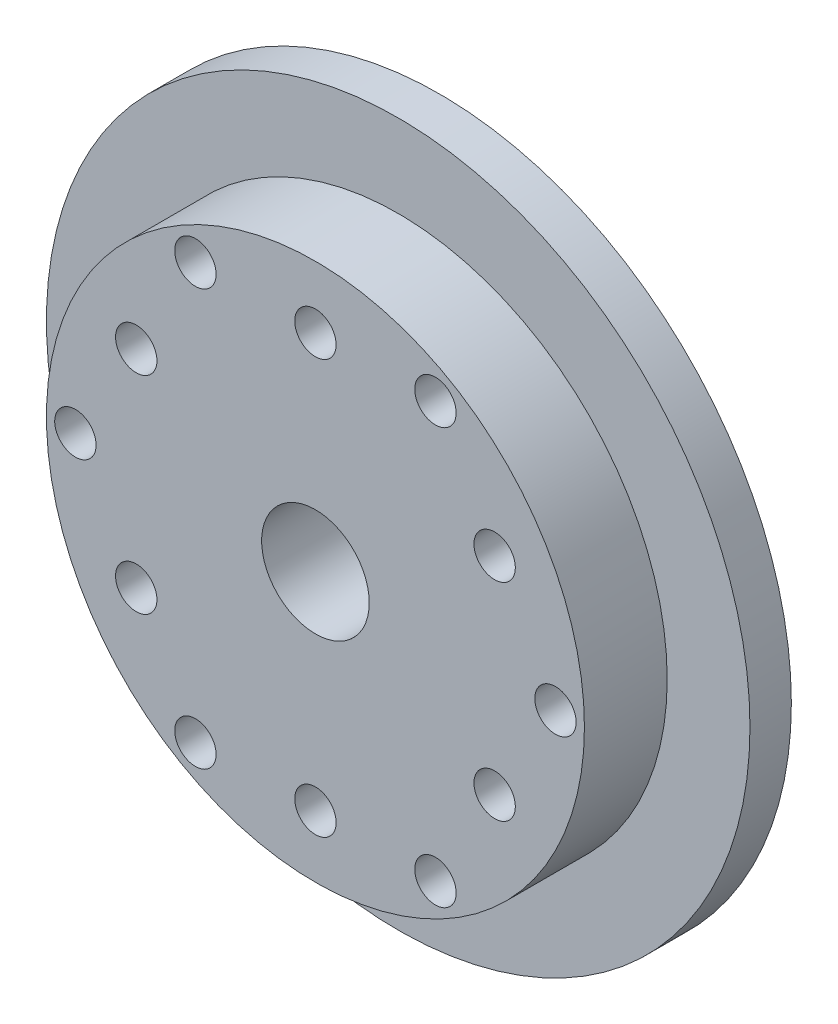
ISO-10303-21;
HEADER;
FILE_DESCRIPTION(('STEP AP214'),'2;1');
FILE_NAME('part.step','',(''),(''),'','','');
FILE_SCHEMA(('AUTOMOTIVE_DESIGN { 1 0 10303 214 1 1 1 1 }'));
ENDSEC;
DATA;
#1=APPLICATION_CONTEXT('core data for automotive mechanical design processes');
#2=APPLICATION_PROTOCOL_DEFINITION('international standard','automotive_design',2000,#1);
#3=PRODUCT_CONTEXT('',#1,'mechanical');
#4=PRODUCT('Part','Part','',(#3));
#5=PRODUCT_RELATED_PRODUCT_CATEGORY('part','',(#4));
#6=PRODUCT_DEFINITION_FORMATION('','',#4);
#7=PRODUCT_DEFINITION_CONTEXT('part definition',#1,'design');
#8=PRODUCT_DEFINITION('design','',#6,#7);
#9=PRODUCT_DEFINITION_SHAPE('','',#8);
#10=(LENGTH_UNIT() NAMED_UNIT(*) SI_UNIT(.MILLI.,.METRE.));
#11=(NAMED_UNIT(*) PLANE_ANGLE_UNIT() SI_UNIT($,.RADIAN.));
#12=(NAMED_UNIT(*) SI_UNIT($,.STERADIAN.) SOLID_ANGLE_UNIT());
#13=UNCERTAINTY_MEASURE_WITH_UNIT(LENGTH_MEASURE(1.E-05),#10,'distance_accuracy_value','');
#14=(GEOMETRIC_REPRESENTATION_CONTEXT(3) GLOBAL_UNCERTAINTY_ASSIGNED_CONTEXT((#13)) GLOBAL_UNIT_ASSIGNED_CONTEXT((#10,
#11,#12)) REPRESENTATION_CONTEXT('',''));
#15=CARTESIAN_POINT('',(0.,0.,0.));
#16=DIRECTION('',(0.,0.,1.));
#17=DIRECTION('',(1.,0.,0.));
#18=AXIS2_PLACEMENT_3D('',#15,#16,#17);
#19=CARTESIAN_POINT('',(0.,0.,5.));
#20=DIRECTION('',(0.,0.,1.));
#21=DIRECTION('',(1.,0.,0.));
#22=AXIS2_PLACEMENT_3D('',#19,#20,#21);
#23=PLANE('',#22);
#24=CARTESIAN_POINT('',(0.,0.,5.));
#25=DIRECTION('',(0.,0.,1.));
#26=DIRECTION('',(1.,0.,0.));
#27=AXIS2_PLACEMENT_3D('',#24,#25,#26);
#28=CIRCLE('',#27,32.5);
#29=CARTESIAN_POINT('',(32.5,0.,5.));
#30=VERTEX_POINT('',#29);
#31=EDGE_CURVE('E67',#30,#30,#28,.T.);
#32=ORIENTED_EDGE('',*,*,#31,.F.);
#33=EDGE_LOOP('',(#32));
#34=FACE_BOUND('',#33,.T.);
#35=CARTESIAN_POINT('',(0.,0.,5.));
#36=DIRECTION('',(0.,0.,1.));
#37=DIRECTION('',(1.,0.,0.));
#38=AXIS2_PLACEMENT_3D('',#35,#36,#37);
#39=CIRCLE('',#38,42.5);
#40=CARTESIAN_POINT('',(42.5,0.,5.));
#41=VERTEX_POINT('',#40);
#42=EDGE_CURVE('E71',#41,#41,#39,.T.);
#43=ORIENTED_EDGE('',*,*,#42,.T.);
#44=EDGE_LOOP('',(#43));
#45=FACE_BOUND('',#44,.T.);
#46=ADVANCED_FACE('F35',(#34,#45),#23,.T.);
#47=CARTESIAN_POINT('',(0.,0.,0.));
#48=DIRECTION('',(0.,0.,1.));
#49=DIRECTION('',(1.,0.,0.));
#50=AXIS2_PLACEMENT_3D('',#47,#48,#49);
#51=PLANE('',#50);
#52=CARTESIAN_POINT('',(15.9099025766971,15.9099025766975,0.));
#53=DIRECTION('',(0.,0.,1.));
#54=DIRECTION('',(1.,0.,0.));
#55=AXIS2_PLACEMENT_3D('',#52,#53,#54);
#56=CIRCLE('',#55,4.);
#57=CARTESIAN_POINT('',(19.9099025766971,15.9099025766975,0.));
#58=VERTEX_POINT('',#57);
#59=EDGE_CURVE('E10',#58,#58,#56,.F.);
#60=ORIENTED_EDGE('',*,*,#59,.F.);
#61=EDGE_LOOP('',(#60));
#62=FACE_BOUND('',#61,.T.);
#63=CARTESIAN_POINT('',(22.5,2.35674990371912E-13,0.));
#64=DIRECTION('',(0.,0.,1.));
#65=DIRECTION('',(1.,0.,0.));
#66=AXIS2_PLACEMENT_3D('',#63,#64,#65);
#67=CIRCLE('',#66,4.);
#68=CARTESIAN_POINT('',(26.5,2.35674990371912E-13,0.));
#69=VERTEX_POINT('',#68);
#70=EDGE_CURVE('E42',#69,#69,#67,.F.);
#71=ORIENTED_EDGE('',*,*,#70,.F.);
#72=EDGE_LOOP('',(#71));
#73=FACE_BOUND('',#72,.T.);
#74=CARTESIAN_POINT('',(15.9099025766975,-15.9099025766972,0.));
#75=DIRECTION('',(0.,0.,1.));
#76=DIRECTION('',(1.,0.,0.));
#77=AXIS2_PLACEMENT_3D('',#74,#75,#76);
#78=CIRCLE('',#77,4.);
#79=CARTESIAN_POINT('',(19.9099025766975,-15.9099025766972,0.));
#80=VERTEX_POINT('',#79);
#81=EDGE_CURVE('E46',#80,#80,#78,.F.);
#82=ORIENTED_EDGE('',*,*,#81,.F.);
#83=EDGE_LOOP('',(#82));
#84=FACE_BOUND('',#83,.T.);
#85=CARTESIAN_POINT('',(1.57116660247941E-13,-22.5,0.));
#86=DIRECTION('',(0.,0.,1.));
#87=DIRECTION('',(1.,0.,0.));
#88=AXIS2_PLACEMENT_3D('',#85,#86,#87);
#89=CIRCLE('',#88,4.);
#90=CARTESIAN_POINT('',(4.00000000000016,-22.5,0.));
#91=VERTEX_POINT('',#90);
#92=EDGE_CURVE('E50',#91,#91,#89,.F.);
#93=ORIENTED_EDGE('',*,*,#92,.F.);
#94=EDGE_LOOP('',(#93));
#95=FACE_BOUND('',#94,.T.);
#96=CARTESIAN_POINT('',(-15.9099025766972,-15.9099025766974,0.));
#97=DIRECTION('',(0.,0.,1.));
#98=DIRECTION('',(1.,0.,0.));
#99=AXIS2_PLACEMENT_3D('',#96,#97,#98);
#100=CIRCLE('',#99,4.);
#101=CARTESIAN_POINT('',(-11.9099025766972,-15.9099025766974,0.));
#102=VERTEX_POINT('',#101);
#103=EDGE_CURVE('E55',#102,#102,#100,.F.);
#104=ORIENTED_EDGE('',*,*,#103,.F.);
#105=EDGE_LOOP('',(#104));
#106=FACE_BOUND('',#105,.T.);
#107=CARTESIAN_POINT('',(-22.5,0.,0.));
#108=DIRECTION('',(0.,0.,1.));
#109=DIRECTION('',(1.,0.,0.));
#110=AXIS2_PLACEMENT_3D('',#107,#108,#109);
#111=CIRCLE('',#110,4.);
#112=CARTESIAN_POINT('',(-18.5,0.,0.));
#113=VERTEX_POINT('',#112);
#114=EDGE_CURVE('E58',#113,#113,#111,.F.);
#115=ORIENTED_EDGE('',*,*,#114,.F.);
#116=EDGE_LOOP('',(#115));
#117=FACE_BOUND('',#116,.T.);
#118=CARTESIAN_POINT('',(-15.9099025766973,15.9099025766973,0.));
#119=DIRECTION('',(0.,0.,1.));
#120=DIRECTION('',(1.,0.,0.));
#121=AXIS2_PLACEMENT_3D('',#118,#119,#120);
#122=CIRCLE('',#121,4.);
#123=CARTESIAN_POINT('',(-11.9099025766973,15.9099025766973,0.));
#124=VERTEX_POINT('',#123);
#125=EDGE_CURVE('E61',#124,#124,#122,.F.);
#126=ORIENTED_EDGE('',*,*,#125,.F.);
#127=EDGE_LOOP('',(#126));
#128=FACE_BOUND('',#127,.T.);
#129=CARTESIAN_POINT('',(0.,22.5,0.));
#130=DIRECTION('',(0.,0.,1.));
#131=DIRECTION('',(1.,0.,0.));
#132=AXIS2_PLACEMENT_3D('',#129,#130,#131);
#133=CIRCLE('',#132,4.);
#134=CARTESIAN_POINT('',(4.,22.5,0.));
#135=VERTEX_POINT('',#134);
#136=EDGE_CURVE('E64',#135,#135,#133,.F.);
#137=ORIENTED_EDGE('',*,*,#136,.F.);
#138=EDGE_LOOP('',(#137));
#139=FACE_BOUND('',#138,.T.);
#140=CARTESIAN_POINT('',(0.,0.,0.));
#141=DIRECTION('',(0.,0.,1.));
#142=DIRECTION('',(1.,0.,0.));
#143=AXIS2_PLACEMENT_3D('',#140,#141,#142);
#144=CIRCLE('',#143,42.5);
#145=CARTESIAN_POINT('',(42.5,0.,0.));
#146=VERTEX_POINT('',#145);
#147=EDGE_CURVE('E68',#146,#146,#144,.T.);
#148=ORIENTED_EDGE('',*,*,#147,.F.);
#149=EDGE_LOOP('',(#148));
#150=FACE_BOUND('',#149,.T.);
#151=CARTESIAN_POINT('',(0.,0.,0.));
#152=DIRECTION('',(0.,0.,1.));
#153=DIRECTION('',(1.,0.,0.));
#154=AXIS2_PLACEMENT_3D('',#151,#152,#153);
#155=CIRCLE('',#154,12.);
#156=CARTESIAN_POINT('',(12.,0.,0.));
#157=VERTEX_POINT('',#156);
#158=EDGE_CURVE('E72',#157,#157,#155,.T.);
#159=ORIENTED_EDGE('',*,*,#158,.T.);
#160=EDGE_LOOP('',(#159));
#161=FACE_BOUND('',#160,.T.);
#162=ADVANCED_FACE('F248',(#62,#73,#84,#95,#106,#117,#128,#139,#150,#161),#51,.F.);
#163=CARTESIAN_POINT('',(0.,0.,5.));
#164=DIRECTION('',(0.,0.,-1.));
#165=DIRECTION('',(-1.,0.,0.));
#166=AXIS2_PLACEMENT_3D('',#163,#164,#165);
#167=CYLINDRICAL_SURFACE('',#166,42.5);
#168=ORIENTED_EDGE('',*,*,#42,.F.);
#169=EDGE_LOOP('',(#168));
#170=FACE_BOUND('',#169,.T.);
#171=ORIENTED_EDGE('',*,*,#147,.T.);
#172=EDGE_LOOP('',(#171));
#173=FACE_BOUND('',#172,.T.);
#174=ADVANCED_FACE('F37',(#170,#173),#167,.T.);
#175=CARTESIAN_POINT('',(0.,0.,5.));
#176=DIRECTION('',(0.,0.,-1.));
#177=DIRECTION('',(-1.,0.,0.));
#178=AXIS2_PLACEMENT_3D('',#175,#176,#177);
#179=CYLINDRICAL_SURFACE('',#178,12.);
#180=CARTESIAN_POINT('',(0.,0.,5.));
#181=DIRECTION('',(0.,0.,1.));
#182=DIRECTION('',(1.,0.,0.));
#183=AXIS2_PLACEMENT_3D('',#180,#181,#182);
#184=CIRCLE('',#183,12.);
#185=CARTESIAN_POINT('',(12.,0.,5.));
#186=VERTEX_POINT('',#185);
#187=EDGE_CURVE('E77',#186,#186,#184,.T.);
#188=ORIENTED_EDGE('',*,*,#187,.T.);
#189=EDGE_LOOP('',(#188));
#190=FACE_BOUND('',#189,.T.);
#191=ORIENTED_EDGE('',*,*,#158,.F.);
#192=EDGE_LOOP('',(#191));
#193=FACE_BOUND('',#192,.T.);
#194=ADVANCED_FACE('F201',(#190,#193),#179,.F.);
#195=CARTESIAN_POINT('',(0.,0.,15.));
#196=DIRECTION('',(0.,0.,1.));
#197=DIRECTION('',(1.,0.,0.));
#198=AXIS2_PLACEMENT_3D('',#195,#196,#197);
#199=PLANE('',#198);
#200=CARTESIAN_POINT('',(29.,0.,15.));
#201=DIRECTION('',(0.,0.,1.));
#202=DIRECTION('',(1.,0.,0.));
#203=AXIS2_PLACEMENT_3D('',#200,#201,#202);
#204=CIRCLE('',#203,2.5);
#205=CARTESIAN_POINT('',(31.5,0.,15.));
#206=VERTEX_POINT('',#205);
#207=EDGE_CURVE('E177',#206,#206,#204,.T.);
#208=ORIENTED_EDGE('',*,*,#207,.F.);
#209=EDGE_LOOP('',(#208));
#210=FACE_BOUND('',#209,.T.);
#211=CARTESIAN_POINT('',(14.5000000000003,25.1147367097486,15.));
#212=DIRECTION('',(0.,0.,1.));
#213=DIRECTION('',(1.,0.,0.));
#214=AXIS2_PLACEMENT_3D('',#211,#212,#213);
#215=CIRCLE('',#214,2.5);
#216=CARTESIAN_POINT('',(17.0000000000003,25.1147367097486,15.));
#217=VERTEX_POINT('',#216);
#218=EDGE_CURVE('E156',#217,#217,#215,.T.);
#219=ORIENTED_EDGE('',*,*,#218,.F.);
#220=EDGE_LOOP('',(#219));
#221=FACE_BOUND('',#220,.T.);
#222=CARTESIAN_POINT('',(-14.4999999999998,25.1147367097489,15.));
#223=DIRECTION('',(0.,0.,1.));
#224=DIRECTION('',(1.,0.,0.));
#225=AXIS2_PLACEMENT_3D('',#222,#223,#224);
#226=CIRCLE('',#225,2.5);
#227=CARTESIAN_POINT('',(-11.9999999999998,25.1147367097489,15.));
#228=VERTEX_POINT('',#227);
#229=EDGE_CURVE('E155',#228,#228,#226,.T.);
#230=ORIENTED_EDGE('',*,*,#229,.F.);
#231=EDGE_LOOP('',(#230));
#232=FACE_BOUND('',#231,.T.);
#233=CARTESIAN_POINT('',(-29.,2.02505917652902E-13,15.));
#234=DIRECTION('',(0.,0.,1.));
#235=DIRECTION('',(1.,0.,0.));
#236=AXIS2_PLACEMENT_3D('',#233,#234,#235);
#237=CIRCLE('',#236,2.5);
#238=CARTESIAN_POINT('',(-26.5,2.02505917652902E-13,15.));
#239=VERTEX_POINT('',#238);
#240=EDGE_CURVE('E162',#239,#239,#237,.T.);
#241=ORIENTED_EDGE('',*,*,#240,.F.);
#242=EDGE_LOOP('',(#241));
#243=FACE_BOUND('',#242,.T.);
#244=CARTESIAN_POINT('',(-14.5000000000001,-25.1147367097486,15.));
#245=DIRECTION('',(0.,0.,1.));
#246=DIRECTION('',(1.,0.,0.));
#247=AXIS2_PLACEMENT_3D('',#244,#245,#246);
#248=CIRCLE('',#247,2.5);
#249=CARTESIAN_POINT('',(-12.0000000000001,-25.1147367097486,15.));
#250=VERTEX_POINT('',#249);
#251=EDGE_CURVE('E168',#250,#250,#248,.T.);
#252=ORIENTED_EDGE('',*,*,#251,.F.);
#253=EDGE_LOOP('',(#252));
#254=FACE_BOUND('',#253,.T.);
#255=CARTESIAN_POINT('',(14.4999999999999,-25.1147367097488,15.));
#256=DIRECTION('',(0.,0.,1.));
#257=DIRECTION('',(1.,0.,0.));
#258=AXIS2_PLACEMENT_3D('',#255,#256,#257);
#259=CIRCLE('',#258,2.5);
#260=CARTESIAN_POINT('',(16.9999999999999,-25.1147367097488,15.));
#261=VERTEX_POINT('',#260);
#262=EDGE_CURVE('E174',#261,#261,#259,.T.);
#263=ORIENTED_EDGE('',*,*,#262,.F.);
#264=EDGE_LOOP('',(#263));
#265=FACE_BOUND('',#264,.T.);
#266=CARTESIAN_POINT('',(0.,25.,15.));
#267=DIRECTION('',(0.,0.,1.));
#268=DIRECTION('',(1.,0.,0.));
#269=AXIS2_PLACEMENT_3D('',#266,#267,#268);
#270=CIRCLE('',#269,2.5);
#271=CARTESIAN_POINT('',(2.5,25.,15.));
#272=VERTEX_POINT('',#271);
#273=EDGE_CURVE('E141',#272,#272,#270,.T.);
#274=ORIENTED_EDGE('',*,*,#273,.F.);
#275=EDGE_LOOP('',(#274));
#276=FACE_BOUND('',#275,.T.);
#277=CARTESIAN_POINT('',(-21.6506350946108,12.5000000000003,15.));
#278=DIRECTION('',(0.,0.,1.));
#279=DIRECTION('',(1.,0.,0.));
#280=AXIS2_PLACEMENT_3D('',#277,#278,#279);
#281=CIRCLE('',#280,2.5);
#282=CARTESIAN_POINT('',(-19.1506350946108,12.5000000000003,15.));
#283=VERTEX_POINT('',#282);
#284=EDGE_CURVE('E120',#283,#283,#281,.T.);
#285=ORIENTED_EDGE('',*,*,#284,.F.);
#286=EDGE_LOOP('',(#285));
#287=FACE_BOUND('',#286,.T.);
#288=CARTESIAN_POINT('',(-21.6506350946111,-12.4999999999998,15.));
#289=DIRECTION('',(0.,0.,1.));
#290=DIRECTION('',(1.,0.,0.));
#291=AXIS2_PLACEMENT_3D('',#288,#289,#290);
#292=CIRCLE('',#291,2.5);
#293=CARTESIAN_POINT('',(-19.1506350946111,-12.4999999999998,15.));
#294=VERTEX_POINT('',#293);
#295=EDGE_CURVE('E119',#294,#294,#292,.T.);
#296=ORIENTED_EDGE('',*,*,#295,.F.);
#297=EDGE_LOOP('',(#296));
#298=FACE_BOUND('',#297,.T.);
#299=CARTESIAN_POINT('',(-1.74574066942157E-13,-25.,15.));
#300=DIRECTION('',(0.,0.,1.));
#301=DIRECTION('',(1.,0.,0.));
#302=AXIS2_PLACEMENT_3D('',#299,#300,#301);
#303=CIRCLE('',#302,2.5);
#304=CARTESIAN_POINT('',(2.49999999999982,-25.,15.));
#305=VERTEX_POINT('',#304);
#306=EDGE_CURVE('E126',#305,#305,#303,.T.);
#307=ORIENTED_EDGE('',*,*,#306,.F.);
#308=EDGE_LOOP('',(#307));
#309=FACE_BOUND('',#308,.T.);
#310=CARTESIAN_POINT('',(21.6506350946109,-12.5000000000001,15.));
#311=DIRECTION('',(0.,0.,1.));
#312=DIRECTION('',(1.,0.,0.));
#313=AXIS2_PLACEMENT_3D('',#310,#311,#312);
#314=CIRCLE('',#313,2.5);
#315=CARTESIAN_POINT('',(24.1506350946109,-12.5000000000001,15.));
#316=VERTEX_POINT('',#315);
#317=EDGE_CURVE('E132',#316,#316,#314,.T.);
#318=ORIENTED_EDGE('',*,*,#317,.F.);
#319=EDGE_LOOP('',(#318));
#320=FACE_BOUND('',#319,.T.);
#321=CARTESIAN_POINT('',(21.650635094611,12.5,15.));
#322=DIRECTION('',(0.,0.,1.));
#323=DIRECTION('',(1.,0.,0.));
#324=AXIS2_PLACEMENT_3D('',#321,#322,#323);
#325=CIRCLE('',#324,2.5);
#326=CARTESIAN_POINT('',(24.150635094611,12.5,15.));
#327=VERTEX_POINT('',#326);
#328=EDGE_CURVE('E138',#327,#327,#325,.T.);
#329=ORIENTED_EDGE('',*,*,#328,.F.);
#330=EDGE_LOOP('',(#329));
#331=FACE_BOUND('',#330,.T.);
#332=CARTESIAN_POINT('',(0.,0.,15.));
#333=DIRECTION('',(0.,0.,1.));
#334=DIRECTION('',(1.,0.,0.));
#335=AXIS2_PLACEMENT_3D('',#332,#333,#334);
#336=CIRCLE('',#335,32.5);
#337=CARTESIAN_POINT('',(32.5,0.,15.));
#338=VERTEX_POINT('',#337);
#339=EDGE_CURVE('E80',#338,#338,#336,.T.);
#340=ORIENTED_EDGE('',*,*,#339,.T.);
#341=EDGE_LOOP('',(#340));
#342=FACE_BOUND('',#341,.T.);
#343=CARTESIAN_POINT('',(0.,0.,15.));
#344=DIRECTION('',(0.,0.,1.));
#345=DIRECTION('',(1.,0.,0.));
#346=AXIS2_PLACEMENT_3D('',#343,#344,#345);
#347=CIRCLE('',#346,6.5);
#348=CARTESIAN_POINT('',(6.5,0.,15.));
#349=VERTEX_POINT('',#348);
#350=EDGE_CURVE('E85',#349,#349,#347,.T.);
#351=ORIENTED_EDGE('',*,*,#350,.F.);
#352=EDGE_LOOP('',(#351));
#353=FACE_BOUND('',#352,.T.);
#354=ADVANCED_FACE('F197',(#210,#221,#232,#243,#254,#265,#276,#287,#298,#309,#320,#331,#342,
#353),#199,.T.);
#355=CARTESIAN_POINT('',(0.,0.,5.));
#356=DIRECTION('',(0.,0.,1.));
#357=DIRECTION('',(1.,0.,0.));
#358=AXIS2_PLACEMENT_3D('',#355,#356,#357);
#359=PLANE('',#358);
#360=ORIENTED_EDGE('',*,*,#187,.F.);
#361=EDGE_LOOP('',(#360));
#362=FACE_BOUND('',#361,.T.);
#363=CARTESIAN_POINT('',(0.,0.,5.));
#364=DIRECTION('',(0.,0.,1.));
#365=DIRECTION('',(1.,0.,0.));
#366=AXIS2_PLACEMENT_3D('',#363,#364,#365);
#367=CIRCLE('',#366,6.5);
#368=CARTESIAN_POINT('',(6.5,0.,5.));
#369=VERTEX_POINT('',#368);
#370=EDGE_CURVE('E86',#369,#369,#367,.T.);
#371=ORIENTED_EDGE('',*,*,#370,.T.);
#372=EDGE_LOOP('',(#371));
#373=FACE_BOUND('',#372,.T.);
#374=ADVANCED_FACE('F200',(#362,#373),#359,.F.);
#375=CARTESIAN_POINT('',(0.,0.,15.));
#376=DIRECTION('',(0.,0.,-1.));
#377=DIRECTION('',(-1.,0.,0.));
#378=AXIS2_PLACEMENT_3D('',#375,#376,#377);
#379=CYLINDRICAL_SURFACE('',#378,32.5);
#380=ORIENTED_EDGE('',*,*,#339,.F.);
#381=EDGE_LOOP('',(#380));
#382=FACE_BOUND('',#381,.T.);
#383=ORIENTED_EDGE('',*,*,#31,.T.);
#384=EDGE_LOOP('',(#383));
#385=FACE_BOUND('',#384,.T.);
#386=ADVANCED_FACE('F233',(#382,#385),#379,.T.);
#387=CARTESIAN_POINT('',(0.,0.,15.));
#388=DIRECTION('',(0.,0.,-1.));
#389=DIRECTION('',(-1.,0.,0.));
#390=AXIS2_PLACEMENT_3D('',#387,#388,#389);
#391=CYLINDRICAL_SURFACE('',#390,6.5);
#392=ORIENTED_EDGE('',*,*,#350,.T.);
#393=EDGE_LOOP('',(#392));
#394=FACE_BOUND('',#393,.T.);
#395=ORIENTED_EDGE('',*,*,#370,.F.);
#396=EDGE_LOOP('',(#395));
#397=FACE_BOUND('',#396,.T.);
#398=ADVANCED_FACE('F229',(#394,#397),#391,.F.);
#399=CARTESIAN_POINT('',(0.,22.5,-10.));
#400=DIRECTION('',(0.,0.,1.));
#401=DIRECTION('',(1.,0.,0.));
#402=AXIS2_PLACEMENT_3D('',#399,#400,#401);
#403=CYLINDRICAL_SURFACE('',#402,4.);
#404=CARTESIAN_POINT('',(0.,22.5,-10.));
#405=DIRECTION('',(0.,0.,-1.));
#406=DIRECTION('',(-1.,0.,0.));
#407=AXIS2_PLACEMENT_3D('',#404,#405,#406);
#408=CIRCLE('',#407,4.);
#409=CARTESIAN_POINT('',(-4.,22.5,-10.));
#410=VERTEX_POINT('',#409);
#411=EDGE_CURVE('E89',#410,#410,#408,.T.);
#412=ORIENTED_EDGE('',*,*,#411,.F.);
#413=EDGE_LOOP('',(#412));
#414=FACE_BOUND('',#413,.T.);
#415=ORIENTED_EDGE('',*,*,#136,.T.);
#416=EDGE_LOOP('',(#415));
#417=FACE_BOUND('',#416,.T.);
#418=ADVANCED_FACE('F232',(#414,#417),#403,.T.);
#419=CARTESIAN_POINT('',(0.,22.5,-10.));
#420=DIRECTION('',(0.,0.,-1.));
#421=DIRECTION('',(-1.,0.,0.));
#422=AXIS2_PLACEMENT_3D('',#419,#420,#421);
#423=PLANE('',#422);
#424=ORIENTED_EDGE('',*,*,#411,.T.);
#425=EDGE_LOOP('',(#424));
#426=FACE_BOUND('',#425,.T.);
#427=ADVANCED_FACE('F292',(#426),#423,.T.);
#428=CARTESIAN_POINT('',(-15.9099025766973,15.9099025766973,-10.));
#429=DIRECTION('',(0.,0.,1.));
#430=DIRECTION('',(1.,0.,0.));
#431=AXIS2_PLACEMENT_3D('',#428,#429,#430);
#432=CYLINDRICAL_SURFACE('',#431,4.);
#433=CARTESIAN_POINT('',(-15.9099025766973,15.9099025766973,-10.));
#434=DIRECTION('',(0.,0.,-1.));
#435=DIRECTION('',(-1.,0.,0.));
#436=AXIS2_PLACEMENT_3D('',#433,#434,#435);
#437=CIRCLE('',#436,4.);
#438=CARTESIAN_POINT('',(-19.9099025766973,15.9099025766973,-10.));
#439=VERTEX_POINT('',#438);
#440=EDGE_CURVE('E94',#439,#439,#437,.T.);
#441=ORIENTED_EDGE('',*,*,#440,.F.);
#442=EDGE_LOOP('',(#441));
#443=FACE_BOUND('',#442,.T.);
#444=ORIENTED_EDGE('',*,*,#125,.T.);
#445=EDGE_LOOP('',(#444));
#446=FACE_BOUND('',#445,.T.);
#447=ADVANCED_FACE('F303',(#443,#446),#432,.T.);
#448=CARTESIAN_POINT('',(-15.9099025766973,15.9099025766973,-10.));
#449=DIRECTION('',(0.,0.,-1.));
#450=DIRECTION('',(-1.,0.,0.));
#451=AXIS2_PLACEMENT_3D('',#448,#449,#450);
#452=PLANE('',#451);
#453=ORIENTED_EDGE('',*,*,#440,.T.);
#454=EDGE_LOOP('',(#453));
#455=FACE_BOUND('',#454,.T.);
#456=ADVANCED_FACE('F314',(#455),#452,.T.);
#457=CARTESIAN_POINT('',(-22.5,0.,-10.));
#458=DIRECTION('',(0.,0.,1.));
#459=DIRECTION('',(1.,0.,0.));
#460=AXIS2_PLACEMENT_3D('',#457,#458,#459);
#461=CYLINDRICAL_SURFACE('',#460,4.);
#462=CARTESIAN_POINT('',(-22.5,0.,-10.));
#463=DIRECTION('',(0.,0.,-1.));
#464=DIRECTION('',(-1.,0.,0.));
#465=AXIS2_PLACEMENT_3D('',#462,#463,#464);
#466=CIRCLE('',#465,4.);
#467=CARTESIAN_POINT('',(-26.5,0.,-10.));
#468=VERTEX_POINT('',#467);
#469=EDGE_CURVE('E97',#468,#468,#466,.T.);
#470=ORIENTED_EDGE('',*,*,#469,.F.);
#471=EDGE_LOOP('',(#470));
#472=FACE_BOUND('',#471,.T.);
#473=ORIENTED_EDGE('',*,*,#114,.T.);
#474=EDGE_LOOP('',(#473));
#475=FACE_BOUND('',#474,.T.);
#476=ADVANCED_FACE('F325',(#472,#475),#461,.T.);
#477=CARTESIAN_POINT('',(-22.5,0.,-10.));
#478=DIRECTION('',(0.,0.,-1.));
#479=DIRECTION('',(-1.,0.,0.));
#480=AXIS2_PLACEMENT_3D('',#477,#478,#479);
#481=PLANE('',#480);
#482=ORIENTED_EDGE('',*,*,#469,.T.);
#483=EDGE_LOOP('',(#482));
#484=FACE_BOUND('',#483,.T.);
#485=ADVANCED_FACE('F336',(#484),#481,.T.);
#486=CARTESIAN_POINT('',(-15.9099025766972,-15.9099025766974,-10.));
#487=DIRECTION('',(0.,0.,1.));
#488=DIRECTION('',(1.,0.,0.));
#489=AXIS2_PLACEMENT_3D('',#486,#487,#488);
#490=CYLINDRICAL_SURFACE('',#489,4.);
#491=CARTESIAN_POINT('',(-15.9099025766972,-15.9099025766974,-10.));
#492=DIRECTION('',(0.,0.,-1.));
#493=DIRECTION('',(-1.,0.,0.));
#494=AXIS2_PLACEMENT_3D('',#491,#492,#493);
#495=CIRCLE('',#494,4.);
#496=CARTESIAN_POINT('',(-19.9099025766972,-15.9099025766974,-10.));
#497=VERTEX_POINT('',#496);
#498=EDGE_CURVE('E100',#497,#497,#495,.T.);
#499=ORIENTED_EDGE('',*,*,#498,.F.);
#500=EDGE_LOOP('',(#499));
#501=FACE_BOUND('',#500,.T.);
#502=ORIENTED_EDGE('',*,*,#103,.T.);
#503=EDGE_LOOP('',(#502));
#504=FACE_BOUND('',#503,.T.);
#505=ADVANCED_FACE('F347',(#501,#504),#490,.T.);
#506=CARTESIAN_POINT('',(-15.9099025766972,-15.9099025766974,-10.));
#507=DIRECTION('',(0.,0.,-1.));
#508=DIRECTION('',(-1.,0.,0.));
#509=AXIS2_PLACEMENT_3D('',#506,#507,#508);
#510=PLANE('',#509);
#511=ORIENTED_EDGE('',*,*,#498,.T.);
#512=EDGE_LOOP('',(#511));
#513=FACE_BOUND('',#512,.T.);
#514=ADVANCED_FACE('F358',(#513),#510,.T.);
#515=CARTESIAN_POINT('',(1.57116660247941E-13,-22.5,-10.));
#516=DIRECTION('',(0.,0.,1.));
#517=DIRECTION('',(1.,0.,0.));
#518=AXIS2_PLACEMENT_3D('',#515,#516,#517);
#519=CYLINDRICAL_SURFACE('',#518,4.);
#520=CARTESIAN_POINT('',(1.57116660247941E-13,-22.5,-10.));
#521=DIRECTION('',(0.,0.,-1.));
#522=DIRECTION('',(-1.,0.,0.));
#523=AXIS2_PLACEMENT_3D('',#520,#521,#522);
#524=CIRCLE('',#523,4.);
#525=CARTESIAN_POINT('',(-3.99999999999984,-22.5,-10.));
#526=VERTEX_POINT('',#525);
#527=EDGE_CURVE('E103',#526,#526,#524,.T.);
#528=ORIENTED_EDGE('',*,*,#527,.F.);
#529=EDGE_LOOP('',(#528));
#530=FACE_BOUND('',#529,.T.);
#531=ORIENTED_EDGE('',*,*,#92,.T.);
#532=EDGE_LOOP('',(#531));
#533=FACE_BOUND('',#532,.T.);
#534=ADVANCED_FACE('F369',(#530,#533),#519,.T.);
#535=CARTESIAN_POINT('',(1.57116660247941E-13,-22.5,-10.));
#536=DIRECTION('',(0.,0.,-1.));
#537=DIRECTION('',(-1.,0.,0.));
#538=AXIS2_PLACEMENT_3D('',#535,#536,#537);
#539=PLANE('',#538);
#540=ORIENTED_EDGE('',*,*,#527,.T.);
#541=EDGE_LOOP('',(#540));
#542=FACE_BOUND('',#541,.T.);
#543=ADVANCED_FACE('F380',(#542),#539,.T.);
#544=CARTESIAN_POINT('',(15.9099025766975,-15.9099025766972,-10.));
#545=DIRECTION('',(0.,0.,1.));
#546=DIRECTION('',(1.,0.,0.));
#547=AXIS2_PLACEMENT_3D('',#544,#545,#546);
#548=CYLINDRICAL_SURFACE('',#547,4.);
#549=CARTESIAN_POINT('',(15.9099025766975,-15.9099025766972,-10.));
#550=DIRECTION('',(0.,0.,-1.));
#551=DIRECTION('',(-1.,0.,0.));
#552=AXIS2_PLACEMENT_3D('',#549,#550,#551);
#553=CIRCLE('',#552,4.);
#554=CARTESIAN_POINT('',(11.9099025766975,-15.9099025766972,-10.));
#555=VERTEX_POINT('',#554);
#556=EDGE_CURVE('E106',#555,#555,#553,.T.);
#557=ORIENTED_EDGE('',*,*,#556,.F.);
#558=EDGE_LOOP('',(#557));
#559=FACE_BOUND('',#558,.T.);
#560=ORIENTED_EDGE('',*,*,#81,.T.);
#561=EDGE_LOOP('',(#560));
#562=FACE_BOUND('',#561,.T.);
#563=ADVANCED_FACE('F391',(#559,#562),#548,.T.);
#564=CARTESIAN_POINT('',(15.9099025766975,-15.9099025766972,-10.));
#565=DIRECTION('',(0.,0.,-1.));
#566=DIRECTION('',(-1.,0.,0.));
#567=AXIS2_PLACEMENT_3D('',#564,#565,#566);
#568=PLANE('',#567);
#569=ORIENTED_EDGE('',*,*,#556,.T.);
#570=EDGE_LOOP('',(#569));
#571=FACE_BOUND('',#570,.T.);
#572=ADVANCED_FACE('F402',(#571),#568,.T.);
#573=CARTESIAN_POINT('',(22.5,2.35674990371912E-13,-10.));
#574=DIRECTION('',(0.,0.,1.));
#575=DIRECTION('',(1.,0.,0.));
#576=AXIS2_PLACEMENT_3D('',#573,#574,#575);
#577=CYLINDRICAL_SURFACE('',#576,4.);
#578=CARTESIAN_POINT('',(22.5,2.35674990371912E-13,-10.));
#579=DIRECTION('',(0.,0.,-1.));
#580=DIRECTION('',(-1.,0.,0.));
#581=AXIS2_PLACEMENT_3D('',#578,#579,#580);
#582=CIRCLE('',#581,4.);
#583=CARTESIAN_POINT('',(18.5,2.35674990371912E-13,-10.));
#584=VERTEX_POINT('',#583);
#585=EDGE_CURVE('E109',#584,#584,#582,.T.);
#586=ORIENTED_EDGE('',*,*,#585,.F.);
#587=EDGE_LOOP('',(#586));
#588=FACE_BOUND('',#587,.T.);
#589=ORIENTED_EDGE('',*,*,#70,.T.);
#590=EDGE_LOOP('',(#589));
#591=FACE_BOUND('',#590,.T.);
#592=ADVANCED_FACE('F413',(#588,#591),#577,.T.);
#593=CARTESIAN_POINT('',(22.5,2.35674990371912E-13,-10.));
#594=DIRECTION('',(0.,0.,-1.));
#595=DIRECTION('',(-1.,0.,0.));
#596=AXIS2_PLACEMENT_3D('',#593,#594,#595);
#597=PLANE('',#596);
#598=ORIENTED_EDGE('',*,*,#585,.T.);
#599=EDGE_LOOP('',(#598));
#600=FACE_BOUND('',#599,.T.);
#601=ADVANCED_FACE('F424',(#600),#597,.T.);
#602=CARTESIAN_POINT('',(15.9099025766971,15.9099025766975,-10.));
#603=DIRECTION('',(0.,0.,1.));
#604=DIRECTION('',(1.,0.,0.));
#605=AXIS2_PLACEMENT_3D('',#602,#603,#604);
#606=CYLINDRICAL_SURFACE('',#605,4.);
#607=CARTESIAN_POINT('',(15.9099025766971,15.9099025766975,-10.));
#608=DIRECTION('',(0.,0.,-1.));
#609=DIRECTION('',(-1.,0.,0.));
#610=AXIS2_PLACEMENT_3D('',#607,#608,#609);
#611=CIRCLE('',#610,4.);
#612=CARTESIAN_POINT('',(11.9099025766971,15.9099025766975,-10.));
#613=VERTEX_POINT('',#612);
#614=EDGE_CURVE('E112',#613,#613,#611,.T.);
#615=ORIENTED_EDGE('',*,*,#614,.F.);
#616=EDGE_LOOP('',(#615));
#617=FACE_BOUND('',#616,.T.);
#618=ORIENTED_EDGE('',*,*,#59,.T.);
#619=EDGE_LOOP('',(#618));
#620=FACE_BOUND('',#619,.T.);
#621=ADVANCED_FACE('F435',(#617,#620),#606,.T.);
#622=CARTESIAN_POINT('',(15.9099025766971,15.9099025766975,-10.));
#623=DIRECTION('',(0.,0.,-1.));
#624=DIRECTION('',(-1.,0.,0.));
#625=AXIS2_PLACEMENT_3D('',#622,#623,#624);
#626=PLANE('',#625);
#627=ORIENTED_EDGE('',*,*,#614,.T.);
#628=EDGE_LOOP('',(#627));
#629=FACE_BOUND('',#628,.T.);
#630=ADVANCED_FACE('F446',(#629),#626,.T.);
#631=CARTESIAN_POINT('',(21.650635094611,12.5,5.));
#632=DIRECTION('',(0.,0.,1.));
#633=DIRECTION('',(1.,0.,0.));
#634=AXIS2_PLACEMENT_3D('',#631,#632,#633);
#635=CYLINDRICAL_SURFACE('',#634,2.5);
#636=CARTESIAN_POINT('',(21.650635094611,12.5,5.));
#637=DIRECTION('',(0.,0.,1.));
#638=DIRECTION('',(1.,0.,0.));
#639=AXIS2_PLACEMENT_3D('',#636,#637,#638);
#640=CIRCLE('',#639,2.5);
#641=CARTESIAN_POINT('',(24.150635094611,12.5,5.));
#642=VERTEX_POINT('',#641);
#643=EDGE_CURVE('E135',#642,#642,#640,.T.);
#644=ORIENTED_EDGE('',*,*,#643,.F.);
#645=EDGE_LOOP('',(#644));
#646=FACE_BOUND('',#645,.T.);
#647=ORIENTED_EDGE('',*,*,#328,.T.);
#648=EDGE_LOOP('',(#647));
#649=FACE_BOUND('',#648,.T.);
#650=ADVANCED_FACE('F457',(#646,#649),#635,.F.);
#651=CARTESIAN_POINT('',(21.650635094611,12.5,5.));
#652=DIRECTION('',(0.,0.,1.));
#653=DIRECTION('',(1.,0.,0.));
#654=AXIS2_PLACEMENT_3D('',#651,#652,#653);
#655=PLANE('',#654);
#656=ORIENTED_EDGE('',*,*,#643,.T.);
#657=EDGE_LOOP('',(#656));
#658=FACE_BOUND('',#657,.T.);
#659=ADVANCED_FACE('F468',(#658),#655,.T.);
#660=CARTESIAN_POINT('',(21.6506350946109,-12.5000000000001,5.));
#661=DIRECTION('',(0.,0.,1.));
#662=DIRECTION('',(1.,0.,0.));
#663=AXIS2_PLACEMENT_3D('',#660,#661,#662);
#664=CYLINDRICAL_SURFACE('',#663,2.5);
#665=CARTESIAN_POINT('',(21.6506350946109,-12.5000000000001,5.));
#666=DIRECTION('',(0.,0.,1.));
#667=DIRECTION('',(1.,0.,0.));
#668=AXIS2_PLACEMENT_3D('',#665,#666,#667);
#669=CIRCLE('',#668,2.5);
#670=CARTESIAN_POINT('',(24.1506350946109,-12.5000000000001,5.));
#671=VERTEX_POINT('',#670);
#672=EDGE_CURVE('E129',#671,#671,#669,.T.);
#673=ORIENTED_EDGE('',*,*,#672,.F.);
#674=EDGE_LOOP('',(#673));
#675=FACE_BOUND('',#674,.T.);
#676=ORIENTED_EDGE('',*,*,#317,.T.);
#677=EDGE_LOOP('',(#676));
#678=FACE_BOUND('',#677,.T.);
#679=ADVANCED_FACE('F479',(#675,#678),#664,.F.);
#680=CARTESIAN_POINT('',(21.6506350946109,-12.5000000000001,5.));
#681=DIRECTION('',(0.,0.,1.));
#682=DIRECTION('',(1.,0.,0.));
#683=AXIS2_PLACEMENT_3D('',#680,#681,#682);
#684=PLANE('',#683);
#685=ORIENTED_EDGE('',*,*,#672,.T.);
#686=EDGE_LOOP('',(#685));
#687=FACE_BOUND('',#686,.T.);
#688=ADVANCED_FACE('F490',(#687),#684,.T.);
#689=CARTESIAN_POINT('',(-1.74574066942157E-13,-25.,5.));
#690=DIRECTION('',(0.,0.,1.));
#691=DIRECTION('',(1.,0.,0.));
#692=AXIS2_PLACEMENT_3D('',#689,#690,#691);
#693=CYLINDRICAL_SURFACE('',#692,2.5);
#694=CARTESIAN_POINT('',(-1.74574066942157E-13,-25.,5.));
#695=DIRECTION('',(0.,0.,1.));
#696=DIRECTION('',(1.,0.,0.));
#697=AXIS2_PLACEMENT_3D('',#694,#695,#696);
#698=CIRCLE('',#697,2.5);
#699=CARTESIAN_POINT('',(2.49999999999982,-25.,5.));
#700=VERTEX_POINT('',#699);
#701=EDGE_CURVE('E123',#700,#700,#698,.T.);
#702=ORIENTED_EDGE('',*,*,#701,.F.);
#703=EDGE_LOOP('',(#702));
#704=FACE_BOUND('',#703,.T.);
#705=ORIENTED_EDGE('',*,*,#306,.T.);
#706=EDGE_LOOP('',(#705));
#707=FACE_BOUND('',#706,.T.);
#708=ADVANCED_FACE('F501',(#704,#707),#693,.F.);
#709=CARTESIAN_POINT('',(-1.74574066942157E-13,-25.,5.));
#710=DIRECTION('',(0.,0.,1.));
#711=DIRECTION('',(1.,0.,0.));
#712=AXIS2_PLACEMENT_3D('',#709,#710,#711);
#713=PLANE('',#712);
#714=ORIENTED_EDGE('',*,*,#701,.T.);
#715=EDGE_LOOP('',(#714));
#716=FACE_BOUND('',#715,.T.);
#717=ADVANCED_FACE('F512',(#716),#713,.T.);
#718=CARTESIAN_POINT('',(-21.6506350946111,-12.4999999999998,5.));
#719=DIRECTION('',(0.,0.,1.));
#720=DIRECTION('',(1.,0.,0.));
#721=AXIS2_PLACEMENT_3D('',#718,#719,#720);
#722=CYLINDRICAL_SURFACE('',#721,2.5);
#723=CARTESIAN_POINT('',(-21.6506350946111,-12.4999999999998,5.));
#724=DIRECTION('',(0.,0.,1.));
#725=DIRECTION('',(1.,0.,0.));
#726=AXIS2_PLACEMENT_3D('',#723,#724,#725);
#727=CIRCLE('',#726,2.5);
#728=CARTESIAN_POINT('',(-19.1506350946111,-12.4999999999998,5.));
#729=VERTEX_POINT('',#728);
#730=EDGE_CURVE('E116',#729,#729,#727,.T.);
#731=ORIENTED_EDGE('',*,*,#730,.F.);
#732=EDGE_LOOP('',(#731));
#733=FACE_BOUND('',#732,.T.);
#734=ORIENTED_EDGE('',*,*,#295,.T.);
#735=EDGE_LOOP('',(#734));
#736=FACE_BOUND('',#735,.T.);
#737=ADVANCED_FACE('F523',(#733,#736),#722,.F.);
#738=CARTESIAN_POINT('',(-21.6506350946111,-12.4999999999998,5.));
#739=DIRECTION('',(0.,0.,1.));
#740=DIRECTION('',(1.,0.,0.));
#741=AXIS2_PLACEMENT_3D('',#738,#739,#740);
#742=PLANE('',#741);
#743=ORIENTED_EDGE('',*,*,#730,.T.);
#744=EDGE_LOOP('',(#743));
#745=FACE_BOUND('',#744,.T.);
#746=ADVANCED_FACE('F534',(#745),#742,.T.);
#747=CARTESIAN_POINT('',(-21.6506350946108,12.5000000000003,5.));
#748=DIRECTION('',(0.,0.,1.));
#749=DIRECTION('',(1.,0.,0.));
#750=AXIS2_PLACEMENT_3D('',#747,#748,#749);
#751=CYLINDRICAL_SURFACE('',#750,2.5);
#752=CARTESIAN_POINT('',(-21.6506350946108,12.5000000000003,5.));
#753=DIRECTION('',(0.,0.,1.));
#754=DIRECTION('',(1.,0.,0.));
#755=AXIS2_PLACEMENT_3D('',#752,#753,#754);
#756=CIRCLE('',#755,2.5);
#757=CARTESIAN_POINT('',(-19.1506350946108,12.5000000000003,5.));
#758=VERTEX_POINT('',#757);
#759=EDGE_CURVE('E142',#758,#758,#756,.T.);
#760=ORIENTED_EDGE('',*,*,#759,.F.);
#761=EDGE_LOOP('',(#760));
#762=FACE_BOUND('',#761,.T.);
#763=ORIENTED_EDGE('',*,*,#284,.T.);
#764=EDGE_LOOP('',(#763));
#765=FACE_BOUND('',#764,.T.);
#766=ADVANCED_FACE('F545',(#762,#765),#751,.F.);
#767=CARTESIAN_POINT('',(-21.6506350946108,12.5000000000003,5.));
#768=DIRECTION('',(0.,0.,1.));
#769=DIRECTION('',(1.,0.,0.));
#770=AXIS2_PLACEMENT_3D('',#767,#768,#769);
#771=PLANE('',#770);
#772=ORIENTED_EDGE('',*,*,#759,.T.);
#773=EDGE_LOOP('',(#772));
#774=FACE_BOUND('',#773,.T.);
#775=ADVANCED_FACE('F556',(#774),#771,.T.);
#776=CARTESIAN_POINT('',(0.,25.,5.));
#777=DIRECTION('',(0.,0.,1.));
#778=DIRECTION('',(1.,0.,0.));
#779=AXIS2_PLACEMENT_3D('',#776,#777,#778);
#780=CYLINDRICAL_SURFACE('',#779,2.5);
#781=CARTESIAN_POINT('',(0.,25.,5.));
#782=DIRECTION('',(0.,0.,1.));
#783=DIRECTION('',(1.,0.,0.));
#784=AXIS2_PLACEMENT_3D('',#781,#782,#783);
#785=CIRCLE('',#784,2.5);
#786=CARTESIAN_POINT('',(2.5,25.,5.));
#787=VERTEX_POINT('',#786);
#788=EDGE_CURVE('E115',#787,#787,#785,.T.);
#789=ORIENTED_EDGE('',*,*,#788,.F.);
#790=EDGE_LOOP('',(#789));
#791=FACE_BOUND('',#790,.T.);
#792=ORIENTED_EDGE('',*,*,#273,.T.);
#793=EDGE_LOOP('',(#792));
#794=FACE_BOUND('',#793,.T.);
#795=ADVANCED_FACE('F567',(#791,#794),#780,.F.);
#796=CARTESIAN_POINT('',(0.,25.,5.));
#797=DIRECTION('',(0.,0.,1.));
#798=DIRECTION('',(1.,0.,0.));
#799=AXIS2_PLACEMENT_3D('',#796,#797,#798);
#800=PLANE('',#799);
#801=ORIENTED_EDGE('',*,*,#788,.T.);
#802=EDGE_LOOP('',(#801));
#803=FACE_BOUND('',#802,.T.);
#804=ADVANCED_FACE('F578',(#803),#800,.T.);
#805=CARTESIAN_POINT('',(14.4999999999999,-25.1147367097488,5.));
#806=DIRECTION('',(0.,0.,1.));
#807=DIRECTION('',(1.,0.,0.));
#808=AXIS2_PLACEMENT_3D('',#805,#806,#807);
#809=CYLINDRICAL_SURFACE('',#808,2.5);
#810=CARTESIAN_POINT('',(14.4999999999999,-25.1147367097488,5.));
#811=DIRECTION('',(0.,0.,1.));
#812=DIRECTION('',(1.,0.,0.));
#813=AXIS2_PLACEMENT_3D('',#810,#811,#812);
#814=CIRCLE('',#813,2.5);
#815=CARTESIAN_POINT('',(16.9999999999999,-25.1147367097488,5.));
#816=VERTEX_POINT('',#815);
#817=EDGE_CURVE('E171',#816,#816,#814,.T.);
#818=ORIENTED_EDGE('',*,*,#817,.F.);
#819=EDGE_LOOP('',(#818));
#820=FACE_BOUND('',#819,.T.);
#821=ORIENTED_EDGE('',*,*,#262,.T.);
#822=EDGE_LOOP('',(#821));
#823=FACE_BOUND('',#822,.T.);
#824=ADVANCED_FACE('F588',(#820,#823),#809,.F.);
#825=CARTESIAN_POINT('',(14.4999999999999,-25.1147367097488,5.));
#826=DIRECTION('',(0.,0.,1.));
#827=DIRECTION('',(1.,0.,0.));
#828=AXIS2_PLACEMENT_3D('',#825,#826,#827);
#829=PLANE('',#828);
#830=ORIENTED_EDGE('',*,*,#817,.T.);
#831=EDGE_LOOP('',(#830));
#832=FACE_BOUND('',#831,.T.);
#833=ADVANCED_FACE('F603',(#832),#829,.T.);
#834=CARTESIAN_POINT('',(-14.5000000000001,-25.1147367097486,5.));
#835=DIRECTION('',(0.,0.,1.));
#836=DIRECTION('',(1.,0.,0.));
#837=AXIS2_PLACEMENT_3D('',#834,#835,#836);
#838=CYLINDRICAL_SURFACE('',#837,2.5);
#839=CARTESIAN_POINT('',(-14.5000000000001,-25.1147367097486,5.));
#840=DIRECTION('',(0.,0.,1.));
#841=DIRECTION('',(1.,0.,0.));
#842=AXIS2_PLACEMENT_3D('',#839,#840,#841);
#843=CIRCLE('',#842,2.5);
#844=CARTESIAN_POINT('',(-12.0000000000001,-25.1147367097486,5.));
#845=VERTEX_POINT('',#844);
#846=EDGE_CURVE('E165',#845,#845,#843,.T.);
#847=ORIENTED_EDGE('',*,*,#846,.F.);
#848=EDGE_LOOP('',(#847));
#849=FACE_BOUND('',#848,.T.);
#850=ORIENTED_EDGE('',*,*,#251,.T.);
#851=EDGE_LOOP('',(#850));
#852=FACE_BOUND('',#851,.T.);
#853=ADVANCED_FACE('F614',(#849,#852),#838,.F.);
#854=CARTESIAN_POINT('',(-14.5000000000001,-25.1147367097486,5.));
#855=DIRECTION('',(0.,0.,1.));
#856=DIRECTION('',(1.,0.,0.));
#857=AXIS2_PLACEMENT_3D('',#854,#855,#856);
#858=PLANE('',#857);
#859=ORIENTED_EDGE('',*,*,#846,.T.);
#860=EDGE_LOOP('',(#859));
#861=FACE_BOUND('',#860,.T.);
#862=ADVANCED_FACE('F625',(#861),#858,.T.);
#863=CARTESIAN_POINT('',(-29.,2.02505917652902E-13,5.));
#864=DIRECTION('',(0.,0.,1.));
#865=DIRECTION('',(1.,0.,0.));
#866=AXIS2_PLACEMENT_3D('',#863,#864,#865);
#867=CYLINDRICAL_SURFACE('',#866,2.5);
#868=CARTESIAN_POINT('',(-29.,2.02505917652902E-13,5.));
#869=DIRECTION('',(0.,0.,1.));
#870=DIRECTION('',(1.,0.,0.));
#871=AXIS2_PLACEMENT_3D('',#868,#869,#870);
#872=CIRCLE('',#871,2.5);
#873=CARTESIAN_POINT('',(-26.5,2.02505917652902E-13,5.));
#874=VERTEX_POINT('',#873);
#875=EDGE_CURVE('E159',#874,#874,#872,.T.);
#876=ORIENTED_EDGE('',*,*,#875,.F.);
#877=EDGE_LOOP('',(#876));
#878=FACE_BOUND('',#877,.T.);
#879=ORIENTED_EDGE('',*,*,#240,.T.);
#880=EDGE_LOOP('',(#879));
#881=FACE_BOUND('',#880,.T.);
#882=ADVANCED_FACE('F636',(#878,#881),#867,.F.);
#883=CARTESIAN_POINT('',(-29.,2.02505917652902E-13,5.));
#884=DIRECTION('',(0.,0.,1.));
#885=DIRECTION('',(1.,0.,0.));
#886=AXIS2_PLACEMENT_3D('',#883,#884,#885);
#887=PLANE('',#886);
#888=ORIENTED_EDGE('',*,*,#875,.T.);
#889=EDGE_LOOP('',(#888));
#890=FACE_BOUND('',#889,.T.);
#891=ADVANCED_FACE('F647',(#890),#887,.T.);
#892=CARTESIAN_POINT('',(-14.4999999999998,25.1147367097489,5.));
#893=DIRECTION('',(0.,0.,1.));
#894=DIRECTION('',(1.,0.,0.));
#895=AXIS2_PLACEMENT_3D('',#892,#893,#894);
#896=CYLINDRICAL_SURFACE('',#895,2.5);
#897=CARTESIAN_POINT('',(-14.4999999999998,25.1147367097489,5.));
#898=DIRECTION('',(0.,0.,1.));
#899=DIRECTION('',(1.,0.,0.));
#900=AXIS2_PLACEMENT_3D('',#897,#898,#899);
#901=CIRCLE('',#900,2.5);
#902=CARTESIAN_POINT('',(-11.9999999999998,25.1147367097489,5.));
#903=VERTEX_POINT('',#902);
#904=EDGE_CURVE('E152',#903,#903,#901,.T.);
#905=ORIENTED_EDGE('',*,*,#904,.F.);
#906=EDGE_LOOP('',(#905));
#907=FACE_BOUND('',#906,.T.);
#908=ORIENTED_EDGE('',*,*,#229,.T.);
#909=EDGE_LOOP('',(#908));
#910=FACE_BOUND('',#909,.T.);
#911=ADVANCED_FACE('F658',(#907,#910),#896,.F.);
#912=CARTESIAN_POINT('',(-14.4999999999998,25.1147367097489,5.));
#913=DIRECTION('',(0.,0.,1.));
#914=DIRECTION('',(1.,0.,0.));
#915=AXIS2_PLACEMENT_3D('',#912,#913,#914);
#916=PLANE('',#915);
#917=ORIENTED_EDGE('',*,*,#904,.T.);
#918=EDGE_LOOP('',(#917));
#919=FACE_BOUND('',#918,.T.);
#920=ADVANCED_FACE('F669',(#919),#916,.T.);
#921=CARTESIAN_POINT('',(14.5000000000003,25.1147367097486,5.));
#922=DIRECTION('',(0.,0.,1.));
#923=DIRECTION('',(1.,0.,0.));
#924=AXIS2_PLACEMENT_3D('',#921,#922,#923);
#925=CYLINDRICAL_SURFACE('',#924,2.5);
#926=CARTESIAN_POINT('',(14.5000000000003,25.1147367097486,5.));
#927=DIRECTION('',(0.,0.,1.));
#928=DIRECTION('',(1.,0.,0.));
#929=AXIS2_PLACEMENT_3D('',#926,#927,#928);
#930=CIRCLE('',#929,2.5);
#931=CARTESIAN_POINT('',(17.0000000000003,25.1147367097486,5.));
#932=VERTEX_POINT('',#931);
#933=EDGE_CURVE('E178',#932,#932,#930,.T.);
#934=ORIENTED_EDGE('',*,*,#933,.F.);
#935=EDGE_LOOP('',(#934));
#936=FACE_BOUND('',#935,.T.);
#937=ORIENTED_EDGE('',*,*,#218,.T.);
#938=EDGE_LOOP('',(#937));
#939=FACE_BOUND('',#938,.T.);
#940=ADVANCED_FACE('F680',(#936,#939),#925,.F.);
#941=CARTESIAN_POINT('',(14.5000000000003,25.1147367097486,5.));
#942=DIRECTION('',(0.,0.,1.));
#943=DIRECTION('',(1.,0.,0.));
#944=AXIS2_PLACEMENT_3D('',#941,#942,#943);
#945=PLANE('',#944);
#946=ORIENTED_EDGE('',*,*,#933,.T.);
#947=EDGE_LOOP('',(#946));
#948=FACE_BOUND('',#947,.T.);
#949=ADVANCED_FACE('F193',(#948),#945,.T.);
#950=CARTESIAN_POINT('',(29.,0.,5.));
#951=DIRECTION('',(0.,0.,1.));
#952=DIRECTION('',(1.,0.,0.));
#953=AXIS2_PLACEMENT_3D('',#950,#951,#952);
#954=CYLINDRICAL_SURFACE('',#953,2.5);
#955=CARTESIAN_POINT('',(29.,0.,5.));
#956=DIRECTION('',(0.,0.,1.));
#957=DIRECTION('',(1.,0.,0.));
#958=AXIS2_PLACEMENT_3D('',#955,#956,#957);
#959=CIRCLE('',#958,2.5);
#960=CARTESIAN_POINT('',(31.5,0.,5.));
#961=VERTEX_POINT('',#960);
#962=EDGE_CURVE('E145',#961,#961,#959,.T.);
#963=ORIENTED_EDGE('',*,*,#962,.F.);
#964=EDGE_LOOP('',(#963));
#965=FACE_BOUND('',#964,.T.);
#966=ORIENTED_EDGE('',*,*,#207,.T.);
#967=EDGE_LOOP('',(#966));
#968=FACE_BOUND('',#967,.T.);
#969=ADVANCED_FACE('F190',(#965,#968),#954,.F.);
#970=CARTESIAN_POINT('',(29.,0.,5.));
#971=DIRECTION('',(0.,0.,1.));
#972=DIRECTION('',(1.,0.,0.));
#973=AXIS2_PLACEMENT_3D('',#970,#971,#972);
#974=PLANE('',#973);
#975=ORIENTED_EDGE('',*,*,#962,.T.);
#976=EDGE_LOOP('',(#975));
#977=FACE_BOUND('',#976,.T.);
#978=ADVANCED_FACE('F188',(#977),#974,.T.);
#979=CLOSED_SHELL('',(#46,#162,#174,#194,#354,#374,#386,#398,#418,#427,#447,#456,#476,#485,#505,
#514,#534,#543,#563,#572,#592,#601,#621,#630,#650,#659,#679,#688,#708,#717,#737,#746,#766,#775,
#795,#804,#824,#833,#853,#862,#882,#891,#911,#920,#940,#949,#969,#978));
#980=MANIFOLD_SOLID_BREP('B2',#979);
#981=ADVANCED_BREP_SHAPE_REPRESENTATION('',(#18,#980),#14);
#982=SHAPE_DEFINITION_REPRESENTATION(#9,#981);
ENDSEC;
END-ISO-10303-21;
